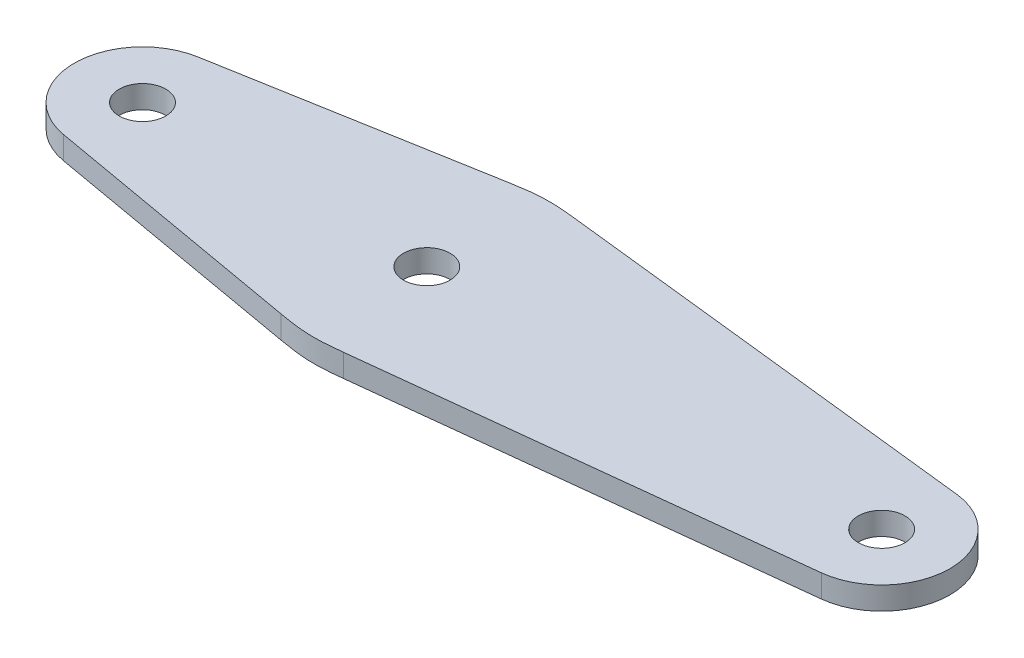
ISO-10303-21;
HEADER;
FILE_DESCRIPTION(('STEP AP214'),'2;1');
FILE_NAME('part.step','',(''),(''),'','','');
FILE_SCHEMA(('AUTOMOTIVE_DESIGN { 1 0 10303 214 1 1 1 1 }'));
ENDSEC;
DATA;
#1=APPLICATION_CONTEXT('core data for automotive mechanical design processes');
#2=APPLICATION_PROTOCOL_DEFINITION('international standard','automotive_design',2000,#1);
#3=PRODUCT_CONTEXT('',#1,'mechanical');
#4=PRODUCT('Part','Part','',(#3));
#5=PRODUCT_RELATED_PRODUCT_CATEGORY('part','',(#4));
#6=PRODUCT_DEFINITION_FORMATION('','',#4);
#7=PRODUCT_DEFINITION_CONTEXT('part definition',#1,'design');
#8=PRODUCT_DEFINITION('design','',#6,#7);
#9=PRODUCT_DEFINITION_SHAPE('','',#8);
#10=(LENGTH_UNIT() NAMED_UNIT(*) SI_UNIT(.MILLI.,.METRE.));
#11=(NAMED_UNIT(*) PLANE_ANGLE_UNIT() SI_UNIT($,.RADIAN.));
#12=(NAMED_UNIT(*) SI_UNIT($,.STERADIAN.) SOLID_ANGLE_UNIT());
#13=UNCERTAINTY_MEASURE_WITH_UNIT(LENGTH_MEASURE(1.E-05),#10,'distance_accuracy_value','');
#14=(GEOMETRIC_REPRESENTATION_CONTEXT(3) GLOBAL_UNCERTAINTY_ASSIGNED_CONTEXT((#13)) GLOBAL_UNIT_ASSIGNED_CONTEXT((#10,
#11,#12)) REPRESENTATION_CONTEXT('',''));
#15=CARTESIAN_POINT('',(0.,0.,0.));
#16=DIRECTION('',(0.,0.,1.));
#17=DIRECTION('',(1.,0.,0.));
#18=AXIS2_PLACEMENT_3D('',#15,#16,#17);
#19=CARTESIAN_POINT('',(130.,4.,0.));
#20=DIRECTION('',(0.,-1.,0.));
#21=DIRECTION('',(0.,0.,-1.));
#22=AXIS2_PLACEMENT_3D('',#19,#20,#21);
#23=PLANE('',#22);
#24=DIRECTION('',(0.984812500658099,0.,0.173621250276402));
#25=VECTOR('',#24,1.);
#26=CARTESIAN_POINT('',(-2.08345500331682,4.,11.8177500078972));
#27=LINE('',#26,#25);
#28=CARTESIAN_POINT('',(-2.08345500331682,4.,11.8177500078972));
#29=VERTEX_POINT('',#28);
#30=CARTESIAN_POINT('',(44.3358907127853,4.,20.0014243975465));
#31=VERTEX_POINT('',#30);
#32=EDGE_CURVE('E138',#29,#31,#27,.T.);
#33=ORIENTED_EDGE('',*,*,#32,.T.);
#34=CARTESIAN_POINT('',(55.7159940801077,4.,20.3622704903322));
#35=CARTESIAN_POINT('',(54.6475349594489,4.,20.4814777361005));
#36=CARTESIAN_POINT('',(53.57907583879,4.,20.6006849818689));
#37=CARTESIAN_POINT('',(51.1952335974193,4.,20.7972506619484));
#38=CARTESIAN_POINT('',(48.8200122778439,4.,20.7219359389617));
#39=CARTESIAN_POINT('',(46.4534118800637,4.,20.3747408129088));
#40=CARTESIAN_POINT('',(45.3946512964245,4.,20.1880826052276));
#41=CARTESIAN_POINT('',(44.3358907127853,4.,20.0014243975465));
#42=B_SPLINE_CURVE_WITH_KNOTS('',5,(#34,#35,#36,#37,#38,#39,#40,#41),.UNSPECIFIED.,.F.,.F.,(6,2,
6),(0.,0.5,1.),.UNSPECIFIED.);
#43=CARTESIAN_POINT('',(55.7159940801077,4.,20.3622704903322));
#44=VERTEX_POINT('',#43);
#45=EDGE_CURVE('E312',#31,#44,#42,.F.);
#46=ORIENTED_EDGE('',*,*,#45,.T.);
#47=DIRECTION('',(0.993833652977741,0.,-0.110881333906657));
#48=VECTOR('',#47,1.);
#49=CARTESIAN_POINT('',(50.,4.,21.));
#50=LINE('',#49,#48);
#51=CARTESIAN_POINT('',(131.33057600688,4.,11.9260038357329));
#52=VERTEX_POINT('',#51);
#53=EDGE_CURVE('E140',#44,#52,#50,.T.);
#54=ORIENTED_EDGE('',*,*,#53,.T.);
#55=CARTESIAN_POINT('',(130.,4.,0.));
#56=DIRECTION('',(0.,1.,0.));
#57=DIRECTION('',(0.,0.,-1.));
#58=AXIS2_PLACEMENT_3D('',#55,#56,#57);
#59=CIRCLE('',#58,12.);
#60=CARTESIAN_POINT('',(131.33057600688,4.,-11.9260038357329));
#61=VERTEX_POINT('',#60);
#62=EDGE_CURVE('E321',#52,#61,#59,.T.);
#63=ORIENTED_EDGE('',*,*,#62,.T.);
#64=DIRECTION('',(-0.993833652977741,0.,-0.110881333906657));
#65=VECTOR('',#64,1.);
#66=CARTESIAN_POINT('',(50.,4.,-21.));
#67=LINE('',#66,#65);
#68=CARTESIAN_POINT('',(55.7159940801077,4.,-20.3622704903322));
#69=VERTEX_POINT('',#68);
#70=EDGE_CURVE('E123',#61,#69,#67,.T.);
#71=ORIENTED_EDGE('',*,*,#70,.T.);
#72=CARTESIAN_POINT('',(44.3358907127853,4.,-20.0014243975465));
#73=CARTESIAN_POINT('',(45.3946512964245,4.,-20.1880826052276));
#74=CARTESIAN_POINT('',(46.4534118800637,4.,-20.3747408129088));
#75=CARTESIAN_POINT('',(48.8200122778439,4.,-20.7219359389617));
#76=CARTESIAN_POINT('',(51.1952335974193,4.,-20.7972506619484));
#77=CARTESIAN_POINT('',(53.57907583879,4.,-20.6006849818689));
#78=CARTESIAN_POINT('',(54.6475349594488,4.,-20.4814777361005));
#79=CARTESIAN_POINT('',(55.7159940801077,4.,-20.3622704903322));
#80=B_SPLINE_CURVE_WITH_KNOTS('',5,(#72,#73,#74,#75,#76,#77,#78,#79),.UNSPECIFIED.,.F.,.F.,(6,2,
6),(0.,0.5,1.),.UNSPECIFIED.);
#81=CARTESIAN_POINT('',(44.3358907127853,4.,-20.0014243975465));
#82=VERTEX_POINT('',#81);
#83=EDGE_CURVE('E64',#69,#82,#80,.F.);
#84=ORIENTED_EDGE('',*,*,#83,.T.);
#85=DIRECTION('',(-0.984812500658099,0.,0.173621250276402));
#86=VECTOR('',#85,1.);
#87=CARTESIAN_POINT('',(-2.08345500331682,4.,-11.8177500078972));
#88=LINE('',#87,#86);
#89=CARTESIAN_POINT('',(-2.08345500331682,4.,-11.8177500078972));
#90=VERTEX_POINT('',#89);
#91=EDGE_CURVE('E113',#82,#90,#88,.T.);
#92=ORIENTED_EDGE('',*,*,#91,.T.);
#93=CARTESIAN_POINT('',(0.,4.,0.));
#94=DIRECTION('',(0.,1.,0.));
#95=DIRECTION('',(0.,0.,-1.));
#96=AXIS2_PLACEMENT_3D('',#93,#94,#95);
#97=CIRCLE('',#96,12.);
#98=EDGE_CURVE('E118',#90,#29,#97,.T.);
#99=ORIENTED_EDGE('',*,*,#98,.T.);
#100=EDGE_LOOP('',(#33,#46,#54,#63,#71,#84,#92,#99));
#101=FACE_BOUND('',#100,.T.);
#102=CARTESIAN_POINT('',(0.,4.,0.));
#103=DIRECTION('',(0.,1.,0.));
#104=DIRECTION('',(0.,0.,1.));
#105=AXIS2_PLACEMENT_3D('',#102,#103,#104);
#106=CIRCLE('',#105,4.1);
#107=CARTESIAN_POINT('',(0.,4.,4.1));
#108=VERTEX_POINT('',#107);
#109=EDGE_CURVE('E494',#108,#108,#106,.T.);
#110=ORIENTED_EDGE('',*,*,#109,.F.);
#111=EDGE_LOOP('',(#110));
#112=FACE_BOUND('',#111,.T.);
#113=CARTESIAN_POINT('',(50.,4.,0.));
#114=DIRECTION('',(0.,1.,0.));
#115=DIRECTION('',(0.,0.,1.));
#116=AXIS2_PLACEMENT_3D('',#113,#114,#115);
#117=CIRCLE('',#116,4.1);
#118=CARTESIAN_POINT('',(50.,4.,4.1));
#119=VERTEX_POINT('',#118);
#120=EDGE_CURVE('E488',#119,#119,#117,.T.);
#121=ORIENTED_EDGE('',*,*,#120,.F.);
#122=EDGE_LOOP('',(#121));
#123=FACE_BOUND('',#122,.T.);
#124=CARTESIAN_POINT('',(130.,4.,0.));
#125=DIRECTION('',(0.,1.,0.));
#126=DIRECTION('',(0.,0.,1.));
#127=AXIS2_PLACEMENT_3D('',#124,#125,#126);
#128=CIRCLE('',#127,4.09999999999999);
#129=CARTESIAN_POINT('',(130.,4.,4.09999999999999));
#130=VERTEX_POINT('',#129);
#131=EDGE_CURVE('E479',#130,#130,#128,.T.);
#132=ORIENTED_EDGE('',*,*,#131,.F.);
#133=EDGE_LOOP('',(#132));
#134=FACE_BOUND('',#133,.T.);
#135=ADVANCED_FACE('F43',(#101,#112,#123,#134),#23,.F.);
#136=CARTESIAN_POINT('',(130.,0.,0.));
#137=DIRECTION('',(0.,-1.,0.));
#138=DIRECTION('',(0.,0.,-1.));
#139=AXIS2_PLACEMENT_3D('',#136,#137,#138);
#140=PLANE('',#139);
#141=CARTESIAN_POINT('',(50.,0.,0.));
#142=DIRECTION('',(0.,1.,0.));
#143=DIRECTION('',(0.,0.,1.));
#144=AXIS2_PLACEMENT_3D('',#141,#142,#143);
#145=CIRCLE('',#144,4.1);
#146=CARTESIAN_POINT('',(50.,0.,4.1));
#147=VERTEX_POINT('',#146);
#148=EDGE_CURVE('E485',#147,#147,#145,.T.);
#149=ORIENTED_EDGE('',*,*,#148,.T.);
#150=EDGE_LOOP('',(#149));
#151=FACE_BOUND('',#150,.T.);
#152=DIRECTION('',(0.993833652977741,0.,-0.110881333906657));
#153=VECTOR('',#152,1.);
#154=CARTESIAN_POINT('',(50.,0.,21.));
#155=LINE('',#154,#153);
#156=CARTESIAN_POINT('',(55.7159940801077,0.,20.3622704903322));
#157=VERTEX_POINT('',#156);
#158=CARTESIAN_POINT('',(131.33057600688,0.,11.9260038357329));
#159=VERTEX_POINT('',#158);
#160=EDGE_CURVE('E330',#157,#159,#155,.T.);
#161=ORIENTED_EDGE('',*,*,#160,.F.);
#162=CARTESIAN_POINT('',(44.3358907127853,0.,20.0014243975465));
#163=CARTESIAN_POINT('',(45.3946512964245,0.,20.1880826052276));
#164=CARTESIAN_POINT('',(46.4534118800637,0.,20.3747408129088));
#165=CARTESIAN_POINT('',(48.8200122778439,0.,20.7219359389617));
#166=CARTESIAN_POINT('',(51.1952335974193,0.,20.7972506619484));
#167=CARTESIAN_POINT('',(53.57907583879,0.,20.6006849818689));
#168=CARTESIAN_POINT('',(54.6475349594488,0.,20.4814777361005));
#169=CARTESIAN_POINT('',(55.7159940801077,0.,20.3622704903322));
#170=B_SPLINE_CURVE_WITH_KNOTS('',5,(#162,#163,#164,#165,#166,#167,#168,#169),.UNSPECIFIED.,.F.,
.F.,(6,2,6),(0.,0.5,1.),.UNSPECIFIED.);
#171=CARTESIAN_POINT('',(44.3358907127853,0.,20.0014243975465));
#172=VERTEX_POINT('',#171);
#173=EDGE_CURVE('E207',#157,#172,#170,.F.);
#174=ORIENTED_EDGE('',*,*,#173,.T.);
#175=DIRECTION('',(0.984812500658099,0.,0.173621250276402));
#176=VECTOR('',#175,1.);
#177=CARTESIAN_POINT('',(-2.08345500331682,0.,11.8177500078972));
#178=LINE('',#177,#176);
#179=CARTESIAN_POINT('',(-2.08345500331682,0.,11.8177500078972));
#180=VERTEX_POINT('',#179);
#181=EDGE_CURVE('E328',#180,#172,#178,.T.);
#182=ORIENTED_EDGE('',*,*,#181,.F.);
#183=CARTESIAN_POINT('',(0.,0.,0.));
#184=DIRECTION('',(0.,1.,0.));
#185=DIRECTION('',(0.,0.,-1.));
#186=AXIS2_PLACEMENT_3D('',#183,#184,#185);
#187=CIRCLE('',#186,12.);
#188=CARTESIAN_POINT('',(-2.08345500331682,0.,-11.8177500078972));
#189=VERTEX_POINT('',#188);
#190=EDGE_CURVE('E332',#189,#180,#187,.T.);
#191=ORIENTED_EDGE('',*,*,#190,.F.);
#192=DIRECTION('',(-0.984812500658099,0.,0.173621250276402));
#193=VECTOR('',#192,1.);
#194=CARTESIAN_POINT('',(-2.08345500331682,0.,-11.8177500078972));
#195=LINE('',#194,#193);
#196=CARTESIAN_POINT('',(44.3358907127853,0.,-20.0014243975465));
#197=VERTEX_POINT('',#196);
#198=EDGE_CURVE('E129',#197,#189,#195,.T.);
#199=ORIENTED_EDGE('',*,*,#198,.F.);
#200=CARTESIAN_POINT('',(55.7159940801077,0.,-20.3622704903322));
#201=CARTESIAN_POINT('',(54.6475349594488,0.,-20.4814777361005));
#202=CARTESIAN_POINT('',(53.57907583879,0.,-20.6006849818689));
#203=CARTESIAN_POINT('',(51.1952335974193,0.,-20.7972506619484));
#204=CARTESIAN_POINT('',(48.8200122778439,0.,-20.7219359389617));
#205=CARTESIAN_POINT('',(46.4534118800637,0.,-20.3747408129088));
#206=CARTESIAN_POINT('',(45.3946512964245,0.,-20.1880826052276));
#207=CARTESIAN_POINT('',(44.3358907127853,0.,-20.0014243975465));
#208=B_SPLINE_CURVE_WITH_KNOTS('',5,(#200,#201,#202,#203,#204,#205,#206,#207),.UNSPECIFIED.,.F.,
.F.,(6,2,6),(0.,0.5,1.),.UNSPECIFIED.);
#209=CARTESIAN_POINT('',(55.7159940801077,0.,-20.3622704903322));
#210=VERTEX_POINT('',#209);
#211=EDGE_CURVE('E259',#197,#210,#208,.F.);
#212=ORIENTED_EDGE('',*,*,#211,.T.);
#213=DIRECTION('',(-0.993833652977741,0.,-0.110881333906657));
#214=VECTOR('',#213,1.);
#215=CARTESIAN_POINT('',(50.,0.,-21.));
#216=LINE('',#215,#214);
#217=CARTESIAN_POINT('',(131.33057600688,0.,-11.9260038357329));
#218=VERTEX_POINT('',#217);
#219=EDGE_CURVE('E340',#218,#210,#216,.T.);
#220=ORIENTED_EDGE('',*,*,#219,.F.);
#221=CARTESIAN_POINT('',(130.,0.,0.));
#222=DIRECTION('',(0.,1.,0.));
#223=DIRECTION('',(0.,0.,-1.));
#224=AXIS2_PLACEMENT_3D('',#221,#222,#223);
#225=CIRCLE('',#224,12.);
#226=EDGE_CURVE('E334',#159,#218,#225,.T.);
#227=ORIENTED_EDGE('',*,*,#226,.F.);
#228=EDGE_LOOP('',(#161,#174,#182,#191,#199,#212,#220,#227));
#229=FACE_BOUND('',#228,.T.);
#230=CARTESIAN_POINT('',(0.,0.,0.));
#231=DIRECTION('',(0.,1.,0.));
#232=DIRECTION('',(0.,0.,1.));
#233=AXIS2_PLACEMENT_3D('',#230,#231,#232);
#234=CIRCLE('',#233,4.1);
#235=CARTESIAN_POINT('',(0.,0.,4.1));
#236=VERTEX_POINT('',#235);
#237=EDGE_CURVE('E491',#236,#236,#234,.T.);
#238=ORIENTED_EDGE('',*,*,#237,.T.);
#239=EDGE_LOOP('',(#238));
#240=FACE_BOUND('',#239,.T.);
#241=CARTESIAN_POINT('',(130.,0.,0.));
#242=DIRECTION('',(0.,1.,0.));
#243=DIRECTION('',(0.,0.,1.));
#244=AXIS2_PLACEMENT_3D('',#241,#242,#243);
#245=CIRCLE('',#244,4.09999999999999);
#246=CARTESIAN_POINT('',(130.,0.,4.09999999999999));
#247=VERTEX_POINT('',#246);
#248=EDGE_CURVE('E482',#247,#247,#245,.T.);
#249=ORIENTED_EDGE('',*,*,#248,.T.);
#250=EDGE_LOOP('',(#249));
#251=FACE_BOUND('',#250,.T.);
#252=ADVANCED_FACE('F289',(#151,#229,#240,#251),#140,.T.);
#253=CARTESIAN_POINT('',(50.,4.,-21.));
#254=DIRECTION('',(-0.110881333906657,0.,0.993833652977741));
#255=DIRECTION('',(0.993833652977741,0.,0.110881333906657));
#256=AXIS2_PLACEMENT_3D('',#253,#254,#255);
#257=PLANE('',#256);
#258=ORIENTED_EDGE('',*,*,#219,.T.);
#259=CARTESIAN_POINT('',(55.7159940801077,4.2,-20.3622704903322));
#260=CARTESIAN_POINT('',(55.7159940801077,2.73333333333504,-20.3622704903322));
#261=CARTESIAN_POINT('',(55.7159940801077,1.26666666666667,-20.3622704903322));
#262=CARTESIAN_POINT('',(55.7159940801077,-0.200000000000001,-20.3622704903322));
#263=B_SPLINE_CURVE_WITH_KNOTS('',3,(#259,#260,#261,#262),.UNSPECIFIED.,.F.,.F.,(4,4),(-0.0002,
0.0042),.UNSPECIFIED.);
#264=EDGE_CURVE('E11',#210,#69,#263,.F.);
#265=ORIENTED_EDGE('',*,*,#264,.T.);
#266=ORIENTED_EDGE('',*,*,#70,.F.);
#267=DIRECTION('',(0.,-1.,0.));
#268=VECTOR('',#267,1.);
#269=CARTESIAN_POINT('',(131.33057600688,4.,-11.9260038357329));
#270=LINE('',#269,#268);
#271=EDGE_CURVE('E358',#61,#218,#270,.T.);
#272=ORIENTED_EDGE('',*,*,#271,.T.);
#273=EDGE_LOOP('',(#258,#265,#266,#272));
#274=FACE_BOUND('',#273,.T.);
#275=ADVANCED_FACE('F183',(#274),#257,.F.);
#276=CARTESIAN_POINT('',(-2.08345500331682,4.,-11.8177500078972));
#277=DIRECTION('',(0.173621250276402,0.,0.984812500658099));
#278=DIRECTION('',(0.984812500658099,0.,-0.173621250276402));
#279=AXIS2_PLACEMENT_3D('',#276,#277,#278);
#280=PLANE('',#279);
#281=ORIENTED_EDGE('',*,*,#91,.F.);
#282=CARTESIAN_POINT('',(44.3358907127853,-0.200000000000001,-20.0014243975465));
#283=CARTESIAN_POINT('',(44.3358907127853,1.26666666666667,-20.0014243975465));
#284=CARTESIAN_POINT('',(44.3358907127853,2.73333333333504,-20.0014243975465));
#285=CARTESIAN_POINT('',(44.3358907127853,4.2,-20.0014243975465));
#286=B_SPLINE_CURVE_WITH_KNOTS('',3,(#282,#283,#284,#285),.UNSPECIFIED.,.F.,.F.,(4,4),(-0.0002,
0.0042),.UNSPECIFIED.);
#287=EDGE_CURVE('E57',#82,#197,#286,.F.);
#288=ORIENTED_EDGE('',*,*,#287,.T.);
#289=ORIENTED_EDGE('',*,*,#198,.T.);
#290=DIRECTION('',(0.,-1.,0.));
#291=VECTOR('',#290,1.);
#292=CARTESIAN_POINT('',(-2.08345500331682,4.,-11.8177500078972));
#293=LINE('',#292,#291);
#294=EDGE_CURVE('E126',#90,#189,#293,.T.);
#295=ORIENTED_EDGE('',*,*,#294,.F.);
#296=EDGE_LOOP('',(#281,#288,#289,#295));
#297=FACE_BOUND('',#296,.T.);
#298=ADVANCED_FACE('F127',(#297),#280,.F.);
#299=CARTESIAN_POINT('',(0.,4.,0.));
#300=DIRECTION('',(0.,-1.,0.));
#301=DIRECTION('',(0.,0.,-1.));
#302=AXIS2_PLACEMENT_3D('',#299,#300,#301);
#303=CYLINDRICAL_SURFACE('',#302,12.);
#304=ORIENTED_EDGE('',*,*,#190,.T.);
#305=DIRECTION('',(0.,-1.,0.));
#306=VECTOR('',#305,1.);
#307=CARTESIAN_POINT('',(-2.08345500331682,4.,11.8177500078972));
#308=LINE('',#307,#306);
#309=EDGE_CURVE('E133',#29,#180,#308,.T.);
#310=ORIENTED_EDGE('',*,*,#309,.F.);
#311=ORIENTED_EDGE('',*,*,#98,.F.);
#312=ORIENTED_EDGE('',*,*,#294,.T.);
#313=EDGE_LOOP('',(#304,#310,#311,#312));
#314=FACE_BOUND('',#313,.T.);
#315=ADVANCED_FACE('F135',(#314),#303,.T.);
#316=CARTESIAN_POINT('',(-2.08345500331682,4.,11.8177500078972));
#317=DIRECTION('',(0.173621250276402,0.,-0.984812500658099));
#318=DIRECTION('',(-0.984812500658099,0.,-0.173621250276402));
#319=AXIS2_PLACEMENT_3D('',#316,#317,#318);
#320=PLANE('',#319);
#321=ORIENTED_EDGE('',*,*,#181,.T.);
#322=CARTESIAN_POINT('',(44.3358907127853,4.2,20.0014243975465));
#323=CARTESIAN_POINT('',(44.3358907127853,2.73333333333504,20.0014243975465));
#324=CARTESIAN_POINT('',(44.3358907127853,1.26666666666667,20.0014243975465));
#325=CARTESIAN_POINT('',(44.3358907127853,-0.200000000000001,20.0014243975465));
#326=B_SPLINE_CURVE_WITH_KNOTS('',3,(#322,#323,#324,#325),.UNSPECIFIED.,.F.,.F.,(4,4),(-0.0002,
0.0042),.UNSPECIFIED.);
#327=EDGE_CURVE('E160',#172,#31,#326,.F.);
#328=ORIENTED_EDGE('',*,*,#327,.T.);
#329=ORIENTED_EDGE('',*,*,#32,.F.);
#330=ORIENTED_EDGE('',*,*,#309,.T.);
#331=EDGE_LOOP('',(#321,#328,#329,#330));
#332=FACE_BOUND('',#331,.T.);
#333=ADVANCED_FACE('F165',(#332),#320,.F.);
#334=CARTESIAN_POINT('',(50.,4.,21.));
#335=DIRECTION('',(-0.110881333906657,0.,-0.993833652977741));
#336=DIRECTION('',(-0.993833652977741,0.,0.110881333906657));
#337=AXIS2_PLACEMENT_3D('',#334,#335,#336);
#338=PLANE('',#337);
#339=ORIENTED_EDGE('',*,*,#53,.F.);
#340=CARTESIAN_POINT('',(55.7159940801077,-0.200000000000001,20.3622704903322));
#341=CARTESIAN_POINT('',(55.7159940801077,1.26666666666667,20.3622704903322));
#342=CARTESIAN_POINT('',(55.7159940801077,2.73333333333504,20.3622704903322));
#343=CARTESIAN_POINT('',(55.7159940801077,4.2,20.3622704903322));
#344=B_SPLINE_CURVE_WITH_KNOTS('',3,(#340,#341,#342,#343),.UNSPECIFIED.,.F.,.F.,(4,4),(-0.0002,
0.0042),.UNSPECIFIED.);
#345=EDGE_CURVE('E132',#44,#157,#344,.F.);
#346=ORIENTED_EDGE('',*,*,#345,.T.);
#347=ORIENTED_EDGE('',*,*,#160,.T.);
#348=DIRECTION('',(0.,-1.,0.));
#349=VECTOR('',#348,1.);
#350=CARTESIAN_POINT('',(131.33057600688,4.,11.9260038357329));
#351=LINE('',#350,#349);
#352=EDGE_CURVE('E319',#52,#159,#351,.T.);
#353=ORIENTED_EDGE('',*,*,#352,.F.);
#354=EDGE_LOOP('',(#339,#346,#347,#353));
#355=FACE_BOUND('',#354,.T.);
#356=ADVANCED_FACE('F175',(#355),#338,.F.);
#357=CARTESIAN_POINT('',(130.,4.,0.));
#358=DIRECTION('',(0.,-1.,0.));
#359=DIRECTION('',(0.,0.,-1.));
#360=AXIS2_PLACEMENT_3D('',#357,#358,#359);
#361=CYLINDRICAL_SURFACE('',#360,12.);
#362=ORIENTED_EDGE('',*,*,#226,.T.);
#363=ORIENTED_EDGE('',*,*,#271,.F.);
#364=ORIENTED_EDGE('',*,*,#62,.F.);
#365=ORIENTED_EDGE('',*,*,#352,.T.);
#366=EDGE_LOOP('',(#362,#363,#364,#365));
#367=FACE_BOUND('',#366,.T.);
#368=ADVANCED_FACE('F364',(#367),#361,.T.);
#369=CARTESIAN_POINT('',(0.,4.,0.));
#370=DIRECTION('',(0.,-1.,0.));
#371=DIRECTION('',(0.,0.,-1.));
#372=AXIS2_PLACEMENT_3D('',#369,#370,#371);
#373=CYLINDRICAL_SURFACE('',#372,4.1);
#374=ORIENTED_EDGE('',*,*,#109,.T.);
#375=EDGE_LOOP('',(#374));
#376=FACE_BOUND('',#375,.T.);
#377=ORIENTED_EDGE('',*,*,#237,.F.);
#378=EDGE_LOOP('',(#377));
#379=FACE_BOUND('',#378,.T.);
#380=ADVANCED_FACE('F297',(#376,#379),#373,.F.);
#381=CARTESIAN_POINT('',(50.,4.,0.));
#382=DIRECTION('',(0.,-1.,0.));
#383=DIRECTION('',(0.,0.,-1.));
#384=AXIS2_PLACEMENT_3D('',#381,#382,#383);
#385=CYLINDRICAL_SURFACE('',#384,4.1);
#386=ORIENTED_EDGE('',*,*,#120,.T.);
#387=EDGE_LOOP('',(#386));
#388=FACE_BOUND('',#387,.T.);
#389=ORIENTED_EDGE('',*,*,#148,.F.);
#390=EDGE_LOOP('',(#389));
#391=FACE_BOUND('',#390,.T.);
#392=ADVANCED_FACE('F399',(#388,#391),#385,.F.);
#393=CARTESIAN_POINT('',(130.,4.,0.));
#394=DIRECTION('',(0.,-1.,0.));
#395=DIRECTION('',(0.,0.,-1.));
#396=AXIS2_PLACEMENT_3D('',#393,#394,#395);
#397=CYLINDRICAL_SURFACE('',#396,4.09999999999999);
#398=ORIENTED_EDGE('',*,*,#131,.T.);
#399=EDGE_LOOP('',(#398));
#400=FACE_BOUND('',#399,.T.);
#401=ORIENTED_EDGE('',*,*,#248,.F.);
#402=EDGE_LOOP('',(#401));
#403=FACE_BOUND('',#402,.T.);
#404=ADVANCED_FACE('F226',(#400,#403),#397,.F.);
#405=CARTESIAN_POINT('',(55.7159940801077,4.2,20.3622704903322));
#406=CARTESIAN_POINT('',(55.7159940801077,2.73333333333504,20.3622704903322));
#407=CARTESIAN_POINT('',(55.7159940801077,1.26666666666667,20.3622704903322));
#408=CARTESIAN_POINT('',(55.7159940801077,-0.200000000000001,20.3622704903322));
#409=CARTESIAN_POINT('',(54.6475349594488,4.2,20.4814777361005));
#410=CARTESIAN_POINT('',(54.6475349594488,2.73333333333504,20.4814777361005));
#411=CARTESIAN_POINT('',(54.6475349594488,1.26666666666667,20.4814777361005));
#412=CARTESIAN_POINT('',(54.6475349594488,-0.200000000000001,20.4814777361005));
#413=CARTESIAN_POINT('',(53.57907583879,4.2,20.6006849818689));
#414=CARTESIAN_POINT('',(53.57907583879,2.73333333333504,20.6006849818689));
#415=CARTESIAN_POINT('',(53.57907583879,1.26666666666667,20.6006849818689));
#416=CARTESIAN_POINT('',(53.57907583879,-0.200000000000001,20.6006849818689));
#417=CARTESIAN_POINT('',(51.1952335974193,4.2,20.7972506619484));
#418=CARTESIAN_POINT('',(51.1952335974193,2.73333333333504,20.7972506619484));
#419=CARTESIAN_POINT('',(51.1952335974193,1.26666666666667,20.7972506619484));
#420=CARTESIAN_POINT('',(51.1952335974193,-0.200000000000001,20.7972506619484));
#421=CARTESIAN_POINT('',(48.8200122778439,4.2,20.7219359389617));
#422=CARTESIAN_POINT('',(48.8200122778439,2.73333333333504,20.7219359389617));
#423=CARTESIAN_POINT('',(48.8200122778439,1.26666666666667,20.7219359389617));
#424=CARTESIAN_POINT('',(48.8200122778439,-0.200000000000001,20.7219359389617));
#425=CARTESIAN_POINT('',(46.4534118800637,4.2,20.3747408129088));
#426=CARTESIAN_POINT('',(46.4534118800637,2.73333333333504,20.3747408129088));
#427=CARTESIAN_POINT('',(46.4534118800637,1.26666666666667,20.3747408129088));
#428=CARTESIAN_POINT('',(46.4534118800637,-0.200000000000001,20.3747408129088));
#429=CARTESIAN_POINT('',(45.3946512964245,4.2,20.1880826052276));
#430=CARTESIAN_POINT('',(45.3946512964245,2.73333333333504,20.1880826052276));
#431=CARTESIAN_POINT('',(45.3946512964245,1.26666666666667,20.1880826052276));
#432=CARTESIAN_POINT('',(45.3946512964245,-0.200000000000001,20.1880826052276));
#433=CARTESIAN_POINT('',(44.3358907127853,4.2,20.0014243975465));
#434=CARTESIAN_POINT('',(44.3358907127853,2.73333333333504,20.0014243975465));
#435=CARTESIAN_POINT('',(44.3358907127853,1.26666666666667,20.0014243975465));
#436=CARTESIAN_POINT('',(44.3358907127853,-0.200000000000001,20.0014243975465));
#437=B_SPLINE_SURFACE_WITH_KNOTS('',5,3,((#405,#406,#407,#408),(#409,#410,#411,#412),(#413,#414,
#415,#416),(#417,#418,#419,#420),(#421,#422,#423,#424),(#425,#426,#427,#428),(#429,#430,#431,
#432),(#433,#434,#435,#436)),.UNSPECIFIED.,.F.,.F.,.F.,(6,2,6),(4,4),(0.,0.5,1.),(-0.0002,
0.0042),.UNSPECIFIED.);
#438=ORIENTED_EDGE('',*,*,#45,.F.);
#439=ORIENTED_EDGE('',*,*,#327,.F.);
#440=ORIENTED_EDGE('',*,*,#173,.F.);
#441=ORIENTED_EDGE('',*,*,#345,.F.);
#442=EDGE_LOOP('',(#438,#439,#440,#441));
#443=FACE_BOUND('',#442,.T.);
#444=ADVANCED_FACE('F214',(#443),#437,.T.);
#445=CARTESIAN_POINT('',(44.3358907127853,4.2,-20.0014243975465));
#446=CARTESIAN_POINT('',(44.3358907127853,2.73333333333504,-20.0014243975465));
#447=CARTESIAN_POINT('',(44.3358907127853,1.26666666666667,-20.0014243975465));
#448=CARTESIAN_POINT('',(44.3358907127853,-0.200000000000001,-20.0014243975465));
#449=CARTESIAN_POINT('',(45.3946512964245,4.2,-20.1880826052276));
#450=CARTESIAN_POINT('',(45.3946512964245,2.73333333333504,-20.1880826052276));
#451=CARTESIAN_POINT('',(45.3946512964245,1.26666666666667,-20.1880826052276));
#452=CARTESIAN_POINT('',(45.3946512964245,-0.200000000000001,-20.1880826052276));
#453=CARTESIAN_POINT('',(46.4534118800637,4.2,-20.3747408129088));
#454=CARTESIAN_POINT('',(46.4534118800637,2.73333333333504,-20.3747408129088));
#455=CARTESIAN_POINT('',(46.4534118800637,1.26666666666667,-20.3747408129088));
#456=CARTESIAN_POINT('',(46.4534118800637,-0.200000000000001,-20.3747408129088));
#457=CARTESIAN_POINT('',(48.8200122778439,4.2,-20.7219359389617));
#458=CARTESIAN_POINT('',(48.8200122778439,2.73333333333504,-20.7219359389617));
#459=CARTESIAN_POINT('',(48.8200122778439,1.26666666666667,-20.7219359389617));
#460=CARTESIAN_POINT('',(48.8200122778439,-0.200000000000001,-20.7219359389617));
#461=CARTESIAN_POINT('',(51.1952335974193,4.2,-20.7972506619484));
#462=CARTESIAN_POINT('',(51.1952335974193,2.73333333333504,-20.7972506619484));
#463=CARTESIAN_POINT('',(51.1952335974193,1.26666666666667,-20.7972506619484));
#464=CARTESIAN_POINT('',(51.1952335974193,-0.200000000000001,-20.7972506619484));
#465=CARTESIAN_POINT('',(53.57907583879,4.2,-20.6006849818689));
#466=CARTESIAN_POINT('',(53.57907583879,2.73333333333504,-20.6006849818689));
#467=CARTESIAN_POINT('',(53.57907583879,1.26666666666667,-20.6006849818689));
#468=CARTESIAN_POINT('',(53.57907583879,-0.200000000000001,-20.6006849818689));
#469=CARTESIAN_POINT('',(54.6475349594488,4.2,-20.4814777361005));
#470=CARTESIAN_POINT('',(54.6475349594488,2.73333333333504,-20.4814777361005));
#471=CARTESIAN_POINT('',(54.6475349594488,1.26666666666667,-20.4814777361005));
#472=CARTESIAN_POINT('',(54.6475349594488,-0.200000000000001,-20.4814777361005));
#473=CARTESIAN_POINT('',(55.7159940801077,4.2,-20.3622704903322));
#474=CARTESIAN_POINT('',(55.7159940801077,2.73333333333504,-20.3622704903322));
#475=CARTESIAN_POINT('',(55.7159940801077,1.26666666666667,-20.3622704903322));
#476=CARTESIAN_POINT('',(55.7159940801077,-0.200000000000001,-20.3622704903322));
#477=B_SPLINE_SURFACE_WITH_KNOTS('',5,3,((#445,#446,#447,#448),(#449,#450,#451,#452),(#453,#454,
#455,#456),(#457,#458,#459,#460),(#461,#462,#463,#464),(#465,#466,#467,#468),(#469,#470,#471,
#472),(#473,#474,#475,#476)),.UNSPECIFIED.,.F.,.F.,.F.,(6,2,6),(4,4),(0.,0.5,1.),(-0.0002,
0.0042),.UNSPECIFIED.);
#478=ORIENTED_EDGE('',*,*,#83,.F.);
#479=ORIENTED_EDGE('',*,*,#264,.F.);
#480=ORIENTED_EDGE('',*,*,#211,.F.);
#481=ORIENTED_EDGE('',*,*,#287,.F.);
#482=EDGE_LOOP('',(#478,#479,#480,#481));
#483=FACE_BOUND('',#482,.T.);
#484=ADVANCED_FACE('F46',(#483),#477,.T.);
#485=CLOSED_SHELL('',(#135,#252,#275,#298,#315,#333,#356,#368,#380,#392,#404,#444,#484));
#486=MANIFOLD_SOLID_BREP('B2',#485);
#487=ADVANCED_BREP_SHAPE_REPRESENTATION('',(#18,#486),#14);
#488=SHAPE_DEFINITION_REPRESENTATION(#9,#487);
ENDSEC;
END-ISO-10303-21;
